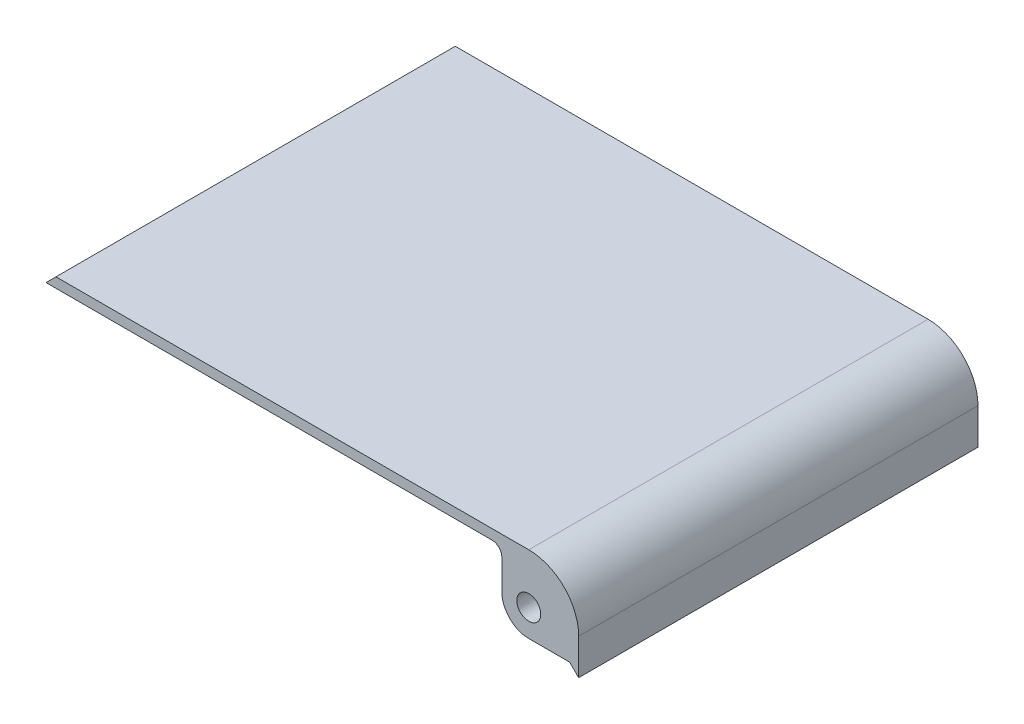
ISO-10303-21;
HEADER;
FILE_DESCRIPTION(('STEP AP214'),'2;1');
FILE_NAME('part.step','',(''),(''),'','','');
FILE_SCHEMA(('AUTOMOTIVE_DESIGN { 1 0 10303 214 1 1 1 1 }'));
ENDSEC;
DATA;
#1=APPLICATION_CONTEXT('core data for automotive mechanical design processes');
#2=APPLICATION_PROTOCOL_DEFINITION('international standard','automotive_design',2000,#1);
#3=PRODUCT_CONTEXT('',#1,'mechanical');
#4=PRODUCT('Part','Part','',(#3));
#5=PRODUCT_RELATED_PRODUCT_CATEGORY('part','',(#4));
#6=PRODUCT_DEFINITION_FORMATION('','',#4);
#7=PRODUCT_DEFINITION_CONTEXT('part definition',#1,'design');
#8=PRODUCT_DEFINITION('design','',#6,#7);
#9=PRODUCT_DEFINITION_SHAPE('','',#8);
#10=(LENGTH_UNIT() NAMED_UNIT(*) SI_UNIT(.MILLI.,.METRE.));
#11=(NAMED_UNIT(*) PLANE_ANGLE_UNIT() SI_UNIT($,.RADIAN.));
#12=(NAMED_UNIT(*) SI_UNIT($,.STERADIAN.) SOLID_ANGLE_UNIT());
#13=UNCERTAINTY_MEASURE_WITH_UNIT(LENGTH_MEASURE(1.E-05),#10,'distance_accuracy_value','');
#14=(GEOMETRIC_REPRESENTATION_CONTEXT(3) GLOBAL_UNCERTAINTY_ASSIGNED_CONTEXT((#13)) GLOBAL_UNIT_ASSIGNED_CONTEXT((#10,
#11,#12)) REPRESENTATION_CONTEXT('',''));
#15=CARTESIAN_POINT('',(0.,0.,0.));
#16=DIRECTION('',(0.,0.,1.));
#17=DIRECTION('',(1.,0.,0.));
#18=AXIS2_PLACEMENT_3D('',#15,#16,#17);
#19=CARTESIAN_POINT('',(170.,0.,80.));
#20=DIRECTION('',(-1.,0.,0.));
#21=DIRECTION('',(0.,0.,1.));
#22=AXIS2_PLACEMENT_3D('',#19,#20,#21);
#23=PLANE('',#22);
#24=DIRECTION('',(0.,-1.,0.));
#25=VECTOR('',#24,1.);
#26=CARTESIAN_POINT('',(170.,133.6,62.));
#27=LINE('',#26,#25);
#28=CARTESIAN_POINT('',(170.,140.,62.));
#29=VERTEX_POINT('',#28);
#30=CARTESIAN_POINT('',(170.,136.6,62.));
#31=VERTEX_POINT('',#30);
#32=EDGE_CURVE('E306',#29,#31,#27,.T.);
#33=ORIENTED_EDGE('',*,*,#32,.F.);
#34=DIRECTION('',(0.,0.,-1.));
#35=VECTOR('',#34,1.);
#36=CARTESIAN_POINT('',(170.,140.,0.));
#37=LINE('',#36,#35);
#38=CARTESIAN_POINT('',(170.,140.,18.));
#39=VERTEX_POINT('',#38);
#40=EDGE_CURVE('E391',#29,#39,#37,.T.);
#41=ORIENTED_EDGE('',*,*,#40,.T.);
#42=DIRECTION('',(0.,1.,0.));
#43=VECTOR('',#42,1.);
#44=CARTESIAN_POINT('',(170.,133.6,18.));
#45=LINE('',#44,#43);
#46=CARTESIAN_POINT('',(170.,136.6,18.));
#47=VERTEX_POINT('',#46);
#48=EDGE_CURVE('E284',#47,#39,#45,.T.);
#49=ORIENTED_EDGE('',*,*,#48,.F.);
#50=DIRECTION('',(0.,0.,-1.));
#51=VECTOR('',#50,1.);
#52=CARTESIAN_POINT('',(170.,136.6,80.));
#53=LINE('',#52,#51);
#54=EDGE_CURVE('E320',#31,#47,#53,.T.);
#55=ORIENTED_EDGE('',*,*,#54,.F.);
#56=EDGE_LOOP('',(#33,#41,#49,#55));
#57=FACE_BOUND('',#56,.T.);
#58=ADVANCED_FACE('F65',(#57),#23,.T.);
#59=CARTESIAN_POINT('',(162.,142.,5.));
#60=DIRECTION('',(0.,0.,-1.));
#61=DIRECTION('',(1.,0.,0.));
#62=AXIS2_PLACEMENT_3D('',#59,#60,#61);
#63=PLANE('',#62);
#64=CARTESIAN_POINT('',(162.,142.,5.));
#65=DIRECTION('',(0.,0.,1.));
#66=DIRECTION('',(1.,0.,0.));
#67=AXIS2_PLACEMENT_3D('',#64,#65,#66);
#68=CIRCLE('',#67,2.4);
#69=CARTESIAN_POINT('',(164.4,142.,5.));
#70=VERTEX_POINT('',#69);
#71=EDGE_CURVE('E325',#70,#70,#68,.T.);
#72=ORIENTED_EDGE('',*,*,#71,.F.);
#73=EDGE_LOOP('',(#72));
#74=FACE_BOUND('',#73,.T.);
#75=DIRECTION('',(0.,-1.,0.));
#76=VECTOR('',#75,1.);
#77=CARTESIAN_POINT('',(168.,133.6,5.));
#78=LINE('',#77,#76);
#79=CARTESIAN_POINT('',(168.,140.99682335333,5.));
#80=VERTEX_POINT('',#79);
#81=CARTESIAN_POINT('',(168.,136.6,5.));
#82=VERTEX_POINT('',#81);
#83=EDGE_CURVE('E272',#80,#82,#78,.T.);
#84=ORIENTED_EDGE('',*,*,#83,.F.);
#85=DIRECTION('',(-0.400237896722259,-0.916411275589374,0.));
#86=VECTOR('',#85,1.);
#87=CARTESIAN_POINT('',(167.389944606836,139.6,5.));
#88=LINE('',#87,#86);
#89=CARTESIAN_POINT('',(169.237430758545,143.830127018922,5.));
#90=VERTEX_POINT('',#89);
#91=EDGE_CURVE('E447',#80,#90,#88,.F.);
#92=ORIENTED_EDGE('',*,*,#91,.T.);
#93=CARTESIAN_POINT('',(160.,140.,5.));
#94=DIRECTION('',(0.,0.,1.));
#95=DIRECTION('',(1.,0.,0.));
#96=AXIS2_PLACEMENT_3D('',#93,#94,#95);
#97=CIRCLE('',#96,10.);
#98=CARTESIAN_POINT('',(160.,150.,5.));
#99=VERTEX_POINT('',#98);
#100=EDGE_CURVE('E338',#90,#99,#97,.T.);
#101=ORIENTED_EDGE('',*,*,#100,.T.);
#102=DIRECTION('',(-1.,0.,0.));
#103=VECTOR('',#102,1.);
#104=CARTESIAN_POINT('',(160.,150.,5.));
#105=LINE('',#104,#103);
#106=CARTESIAN_POINT('',(154.6,150.,5.));
#107=VERTEX_POINT('',#106);
#108=EDGE_CURVE('E336',#99,#107,#105,.T.);
#109=ORIENTED_EDGE('',*,*,#108,.T.);
#110=CARTESIAN_POINT('',(154.6,148.,5.));
#111=DIRECTION('',(0.,0.,-1.));
#112=DIRECTION('',(-1.,0.,0.));
#113=AXIS2_PLACEMENT_3D('',#110,#111,#112);
#114=CIRCLE('',#113,2.);
#115=CARTESIAN_POINT('',(156.6,148.,5.));
#116=VERTEX_POINT('',#115);
#117=EDGE_CURVE('E427',#107,#116,#114,.T.);
#118=ORIENTED_EDGE('',*,*,#117,.T.);
#119=DIRECTION('',(0.,-1.,0.));
#120=VECTOR('',#119,1.);
#121=CARTESIAN_POINT('',(156.6,142.,5.));
#122=LINE('',#121,#120);
#123=CARTESIAN_POINT('',(156.6,142.,5.));
#124=VERTEX_POINT('',#123);
#125=EDGE_CURVE('E334',#116,#124,#122,.T.);
#126=ORIENTED_EDGE('',*,*,#125,.T.);
#127=CARTESIAN_POINT('',(162.,142.,5.));
#128=DIRECTION('',(0.,0.,1.));
#129=DIRECTION('',(1.,0.,0.));
#130=AXIS2_PLACEMENT_3D('',#127,#128,#129);
#131=CIRCLE('',#130,5.39999999999999);
#132=CARTESIAN_POINT('',(162.,136.6,5.));
#133=VERTEX_POINT('',#132);
#134=EDGE_CURVE('E331',#124,#133,#131,.T.);
#135=ORIENTED_EDGE('',*,*,#134,.T.);
#136=DIRECTION('',(1.,0.,0.));
#137=VECTOR('',#136,1.);
#138=CARTESIAN_POINT('',(162.,136.6,5.));
#139=LINE('',#138,#137);
#140=EDGE_CURVE('E341',#133,#82,#139,.T.);
#141=ORIENTED_EDGE('',*,*,#140,.T.);
#142=EDGE_LOOP('',(#84,#92,#101,#109,#118,#126,#135,#141));
#143=FACE_BOUND('',#142,.T.);
#144=ADVANCED_FACE('F500',(#74,#143),#63,.F.);
#145=CARTESIAN_POINT('',(162.,142.,75.));
#146=DIRECTION('',(0.,0.,1.));
#147=DIRECTION('',(1.,0.,0.));
#148=AXIS2_PLACEMENT_3D('',#145,#146,#147);
#149=PLANE('',#148);
#150=CARTESIAN_POINT('',(162.,142.,75.));
#151=DIRECTION('',(0.,0.,1.));
#152=DIRECTION('',(1.,0.,0.));
#153=AXIS2_PLACEMENT_3D('',#150,#151,#152);
#154=CIRCLE('',#153,2.4);
#155=CARTESIAN_POINT('',(164.4,142.,75.));
#156=VERTEX_POINT('',#155);
#157=EDGE_CURVE('E355',#156,#156,#154,.T.);
#158=ORIENTED_EDGE('',*,*,#157,.T.);
#159=EDGE_LOOP('',(#158));
#160=FACE_BOUND('',#159,.T.);
#161=DIRECTION('',(0.400237896722256,0.916411275589375,0.));
#162=VECTOR('',#161,1.);
#163=CARTESIAN_POINT('',(167.389944606836,139.6,75.));
#164=LINE('',#163,#162);
#165=CARTESIAN_POINT('',(169.237430758545,143.830127018922,75.));
#166=VERTEX_POINT('',#165);
#167=CARTESIAN_POINT('',(168.,140.99682335333,75.));
#168=VERTEX_POINT('',#167);
#169=EDGE_CURVE('E444',#166,#168,#164,.F.);
#170=ORIENTED_EDGE('',*,*,#169,.T.);
#171=DIRECTION('',(0.,-1.,0.));
#172=VECTOR('',#171,1.);
#173=CARTESIAN_POINT('',(168.,142.,75.));
#174=LINE('',#173,#172);
#175=CARTESIAN_POINT('',(168.,136.6,75.));
#176=VERTEX_POINT('',#175);
#177=EDGE_CURVE('E429',#168,#176,#174,.T.);
#178=ORIENTED_EDGE('',*,*,#177,.T.);
#179=DIRECTION('',(1.,0.,0.));
#180=VECTOR('',#179,1.);
#181=CARTESIAN_POINT('',(162.,136.6,75.));
#182=LINE('',#181,#180);
#183=CARTESIAN_POINT('',(162.,136.6,75.));
#184=VERTEX_POINT('',#183);
#185=EDGE_CURVE('E366',#184,#176,#182,.T.);
#186=ORIENTED_EDGE('',*,*,#185,.F.);
#187=CARTESIAN_POINT('',(162.,142.,75.));
#188=DIRECTION('',(0.,0.,1.));
#189=DIRECTION('',(1.,0.,0.));
#190=AXIS2_PLACEMENT_3D('',#187,#188,#189);
#191=CIRCLE('',#190,5.39999999999999);
#192=CARTESIAN_POINT('',(156.6,142.,75.));
#193=VERTEX_POINT('',#192);
#194=EDGE_CURVE('E361',#193,#184,#191,.T.);
#195=ORIENTED_EDGE('',*,*,#194,.F.);
#196=DIRECTION('',(0.,-1.,0.));
#197=VECTOR('',#196,1.);
#198=CARTESIAN_POINT('',(156.6,142.,75.));
#199=LINE('',#198,#197);
#200=CARTESIAN_POINT('',(156.6,148.,75.));
#201=VERTEX_POINT('',#200);
#202=EDGE_CURVE('E373',#201,#193,#199,.T.);
#203=ORIENTED_EDGE('',*,*,#202,.F.);
#204=CARTESIAN_POINT('',(154.6,148.,75.));
#205=DIRECTION('',(0.,0.,1.));
#206=DIRECTION('',(1.,0.,0.));
#207=AXIS2_PLACEMENT_3D('',#204,#205,#206);
#208=CIRCLE('',#207,2.);
#209=CARTESIAN_POINT('',(154.6,150.,75.));
#210=VERTEX_POINT('',#209);
#211=EDGE_CURVE('E416',#201,#210,#208,.T.);
#212=ORIENTED_EDGE('',*,*,#211,.T.);
#213=DIRECTION('',(-1.,0.,0.));
#214=VECTOR('',#213,1.);
#215=CARTESIAN_POINT('',(160.,150.,75.));
#216=LINE('',#215,#214);
#217=CARTESIAN_POINT('',(160.,150.,75.));
#218=VERTEX_POINT('',#217);
#219=EDGE_CURVE('E371',#218,#210,#216,.T.);
#220=ORIENTED_EDGE('',*,*,#219,.F.);
#221=CARTESIAN_POINT('',(160.,140.,75.));
#222=DIRECTION('',(0.,0.,1.));
#223=DIRECTION('',(1.,0.,0.));
#224=AXIS2_PLACEMENT_3D('',#221,#222,#223);
#225=CIRCLE('',#224,10.);
#226=EDGE_CURVE('E369',#166,#218,#225,.T.);
#227=ORIENTED_EDGE('',*,*,#226,.F.);
#228=EDGE_LOOP('',(#170,#178,#186,#195,#203,#212,#220,#227));
#229=FACE_BOUND('',#228,.T.);
#230=ADVANCED_FACE('F511',(#160,#229),#149,.F.);
#231=CARTESIAN_POINT('',(170.,150.,80.));
#232=DIRECTION('',(0.,-1.,0.));
#233=DIRECTION('',(1.,0.,0.));
#234=AXIS2_PLACEMENT_3D('',#231,#232,#233);
#235=PLANE('',#234);
#236=DIRECTION('',(0.,0.,-1.));
#237=VECTOR('',#236,1.);
#238=CARTESIAN_POINT('',(65.2822509939086,150.,80.));
#239=LINE('',#238,#237);
#240=CARTESIAN_POINT('',(65.2822509939086,150.,80.));
#241=VERTEX_POINT('',#240);
#242=CARTESIAN_POINT('',(65.2822509939086,150.,0.));
#243=VERTEX_POINT('',#242);
#244=EDGE_CURVE('E318',#241,#243,#239,.T.);
#245=ORIENTED_EDGE('',*,*,#244,.T.);
#246=DIRECTION('',(-1.,0.,0.));
#247=VECTOR('',#246,1.);
#248=CARTESIAN_POINT('',(170.,150.,0.));
#249=LINE('',#248,#247);
#250=CARTESIAN_POINT('',(154.6,150.,0.));
#251=VERTEX_POINT('',#250);
#252=EDGE_CURVE('E382',#251,#243,#249,.T.);
#253=ORIENTED_EDGE('',*,*,#252,.F.);
#254=DIRECTION('',(0.,0.,-1.));
#255=VECTOR('',#254,1.);
#256=CARTESIAN_POINT('',(154.6,150.,80.));
#257=LINE('',#256,#255);
#258=EDGE_CURVE('E422',#251,#107,#257,.F.);
#259=ORIENTED_EDGE('',*,*,#258,.T.);
#260=ORIENTED_EDGE('',*,*,#108,.F.);
#261=DIRECTION('',(0.,0.,-1.));
#262=VECTOR('',#261,1.);
#263=CARTESIAN_POINT('',(160.,150.,80.));
#264=LINE('',#263,#262);
#265=EDGE_CURVE('E397',#99,#218,#264,.F.);
#266=ORIENTED_EDGE('',*,*,#265,.T.);
#267=ORIENTED_EDGE('',*,*,#219,.T.);
#268=DIRECTION('',(0.,0.,1.));
#269=VECTOR('',#268,1.);
#270=CARTESIAN_POINT('',(154.6,150.,80.));
#271=LINE('',#270,#269);
#272=CARTESIAN_POINT('',(154.6,150.,80.));
#273=VERTEX_POINT('',#272);
#274=EDGE_CURVE('E409',#210,#273,#271,.T.);
#275=ORIENTED_EDGE('',*,*,#274,.T.);
#276=DIRECTION('',(-1.,0.,0.));
#277=VECTOR('',#276,1.);
#278=CARTESIAN_POINT('',(170.,150.,80.));
#279=LINE('',#278,#277);
#280=EDGE_CURVE('E384',#273,#241,#279,.T.);
#281=ORIENTED_EDGE('',*,*,#280,.T.);
#282=EDGE_LOOP('',(#245,#253,#259,#260,#266,#267,#275,#281));
#283=FACE_BOUND('',#282,.T.);
#284=ADVANCED_FACE('F468',(#283),#235,.T.);
#285=CARTESIAN_POINT('',(160.,140.,80.));
#286=DIRECTION('',(0.,0.,1.));
#287=DIRECTION('',(1.,0.,0.));
#288=AXIS2_PLACEMENT_3D('',#285,#286,#287);
#289=CYLINDRICAL_SURFACE('',#288,10.);
#290=ORIENTED_EDGE('',*,*,#40,.F.);
#291=CARTESIAN_POINT('',(160.,140.,62.));
#292=DIRECTION('',(0.,0.,1.));
#293=DIRECTION('',(1.,0.,0.));
#294=AXIS2_PLACEMENT_3D('',#291,#292,#293);
#295=CIRCLE('',#294,10.);
#296=CARTESIAN_POINT('',(169.237430758545,143.830127018922,62.));
#297=VERTEX_POINT('',#296);
#298=EDGE_CURVE('E441',#29,#297,#295,.T.);
#299=ORIENTED_EDGE('',*,*,#298,.T.);
#300=DIRECTION('',(0.,0.,1.));
#301=VECTOR('',#300,1.);
#302=CARTESIAN_POINT('',(169.237430758545,143.830127018922,80.));
#303=LINE('',#302,#301);
#304=EDGE_CURVE('E438',#297,#166,#303,.T.);
#305=ORIENTED_EDGE('',*,*,#304,.T.);
#306=ORIENTED_EDGE('',*,*,#226,.T.);
#307=ORIENTED_EDGE('',*,*,#265,.F.);
#308=ORIENTED_EDGE('',*,*,#100,.F.);
#309=DIRECTION('',(0.,0.,1.));
#310=VECTOR('',#309,1.);
#311=CARTESIAN_POINT('',(169.237430758545,143.830127018922,80.));
#312=LINE('',#311,#310);
#313=CARTESIAN_POINT('',(169.237430758545,143.830127018922,18.));
#314=VERTEX_POINT('',#313);
#315=EDGE_CURVE('E435',#90,#314,#312,.T.);
#316=ORIENTED_EDGE('',*,*,#315,.T.);
#317=CARTESIAN_POINT('',(160.,140.,18.));
#318=DIRECTION('',(0.,0.,-1.));
#319=DIRECTION('',(-1.,0.,0.));
#320=AXIS2_PLACEMENT_3D('',#317,#318,#319);
#321=CIRCLE('',#320,10.);
#322=EDGE_CURVE('E432',#314,#39,#321,.T.);
#323=ORIENTED_EDGE('',*,*,#322,.T.);
#324=EDGE_LOOP('',(#290,#299,#305,#306,#307,#308,#316,#323));
#325=FACE_BOUND('',#324,.T.);
#326=ADVANCED_FACE('F506',(#325),#289,.F.);
#327=CARTESIAN_POINT('',(0.,0.,80.));
#328=DIRECTION('',(0.,0.,1.));
#329=DIRECTION('',(1.,0.,0.));
#330=AXIS2_PLACEMENT_3D('',#327,#328,#329);
#331=PLANE('',#330);
#332=DIRECTION('',(-1.,0.,0.));
#333=VECTOR('',#332,1.);
#334=CARTESIAN_POINT('',(170.,152.,80.));
#335=LINE('',#334,#333);
#336=CARTESIAN_POINT('',(162.,152.,80.));
#337=VERTEX_POINT('',#336);
#338=CARTESIAN_POINT('',(67.2822509939086,152.,80.));
#339=VERTEX_POINT('',#338);
#340=EDGE_CURVE('E253',#337,#339,#335,.T.);
#341=ORIENTED_EDGE('',*,*,#340,.T.);
#342=DIRECTION('',(0.707106781186548,0.707106781186548,0.));
#343=VECTOR('',#342,1.);
#344=CARTESIAN_POINT('',(-42.3588745030457,42.3588745030457,80.));
#345=LINE('',#344,#343);
#346=EDGE_CURVE('E73',#339,#241,#345,.F.);
#347=ORIENTED_EDGE('',*,*,#346,.T.);
#348=ORIENTED_EDGE('',*,*,#280,.F.);
#349=CARTESIAN_POINT('',(154.6,148.,80.));
#350=DIRECTION('',(0.,0.,1.));
#351=DIRECTION('',(1.,0.,0.));
#352=AXIS2_PLACEMENT_3D('',#349,#350,#351);
#353=CIRCLE('',#352,2.);
#354=CARTESIAN_POINT('',(156.6,148.,80.));
#355=VERTEX_POINT('',#354);
#356=EDGE_CURVE('E414',#273,#355,#353,.F.);
#357=ORIENTED_EDGE('',*,*,#356,.T.);
#358=DIRECTION('',(0.,-1.,0.));
#359=VECTOR('',#358,1.);
#360=CARTESIAN_POINT('',(156.6,142.,80.));
#361=LINE('',#360,#359);
#362=CARTESIAN_POINT('',(156.6,142.,80.));
#363=VERTEX_POINT('',#362);
#364=EDGE_CURVE('E365',#355,#363,#361,.T.);
#365=ORIENTED_EDGE('',*,*,#364,.T.);
#366=CARTESIAN_POINT('',(162.,142.,80.));
#367=DIRECTION('',(0.,0.,1.));
#368=DIRECTION('',(1.,0.,0.));
#369=AXIS2_PLACEMENT_3D('',#366,#367,#368);
#370=CIRCLE('',#369,5.39999999999999);
#371=CARTESIAN_POINT('',(162.,136.6,80.));
#372=VERTEX_POINT('',#371);
#373=EDGE_CURVE('E358',#363,#372,#370,.T.);
#374=ORIENTED_EDGE('',*,*,#373,.T.);
#375=DIRECTION('',(1.,0.,0.));
#376=VECTOR('',#375,1.);
#377=CARTESIAN_POINT('',(162.,136.6,80.));
#378=LINE('',#377,#376);
#379=CARTESIAN_POINT('',(170.2,136.6,80.));
#380=VERTEX_POINT('',#379);
#381=EDGE_CURVE('E266',#372,#380,#378,.T.);
#382=ORIENTED_EDGE('',*,*,#381,.T.);
#383=DIRECTION('',(0.707106781186542,-0.707106781186553,0.));
#384=VECTOR('',#383,1.);
#385=CARTESIAN_POINT('',(172.,134.8,80.));
#386=LINE('',#385,#384);
#387=CARTESIAN_POINT('',(172.,134.8,80.));
#388=VERTEX_POINT('',#387);
#389=EDGE_CURVE('E259',#380,#388,#386,.T.);
#390=ORIENTED_EDGE('',*,*,#389,.T.);
#391=DIRECTION('',(0.,1.,0.));
#392=VECTOR('',#391,1.);
#393=CARTESIAN_POINT('',(172.,0.,80.));
#394=LINE('',#393,#392);
#395=CARTESIAN_POINT('',(172.,142.,80.));
#396=VERTEX_POINT('',#395);
#397=EDGE_CURVE('E243',#388,#396,#394,.T.);
#398=ORIENTED_EDGE('',*,*,#397,.T.);
#399=CARTESIAN_POINT('',(162.,142.,80.));
#400=DIRECTION('',(0.,0.,1.));
#401=DIRECTION('',(1.,0.,0.));
#402=AXIS2_PLACEMENT_3D('',#399,#400,#401);
#403=CIRCLE('',#402,10.);
#404=EDGE_CURVE('E407',#396,#337,#403,.T.);
#405=ORIENTED_EDGE('',*,*,#404,.T.);
#406=EDGE_LOOP('',(#341,#347,#348,#357,#365,#374,#382,#390,#398,#405));
#407=FACE_BOUND('',#406,.T.);
#408=CARTESIAN_POINT('',(162.,142.,80.));
#409=DIRECTION('',(0.,0.,1.));
#410=DIRECTION('',(1.,0.,0.));
#411=AXIS2_PLACEMENT_3D('',#408,#409,#410);
#412=CIRCLE('',#411,2.4);
#413=CARTESIAN_POINT('',(164.4,142.,80.));
#414=VERTEX_POINT('',#413);
#415=EDGE_CURVE('E352',#414,#414,#412,.T.);
#416=ORIENTED_EDGE('',*,*,#415,.F.);
#417=EDGE_LOOP('',(#416));
#418=FACE_BOUND('',#417,.T.);
#419=ADVANCED_FACE('F263',(#407,#418),#331,.T.);
#420=CARTESIAN_POINT('',(0.,0.,0.));
#421=DIRECTION('',(0.,0.,1.));
#422=DIRECTION('',(1.,0.,0.));
#423=AXIS2_PLACEMENT_3D('',#420,#421,#422);
#424=PLANE('',#423);
#425=ORIENTED_EDGE('',*,*,#252,.T.);
#426=DIRECTION('',(-0.707106781186548,-0.707106781186548,0.));
#427=VECTOR('',#426,1.);
#428=CARTESIAN_POINT('',(67.2822509939086,152.,0.));
#429=LINE('',#428,#427);
#430=CARTESIAN_POINT('',(67.2822509939086,152.,0.));
#431=VERTEX_POINT('',#430);
#432=EDGE_CURVE('E12',#243,#431,#429,.F.);
#433=ORIENTED_EDGE('',*,*,#432,.T.);
#434=DIRECTION('',(-1.,0.,0.));
#435=VECTOR('',#434,1.);
#436=CARTESIAN_POINT('',(170.,152.,0.));
#437=LINE('',#436,#435);
#438=CARTESIAN_POINT('',(162.,152.,0.));
#439=VERTEX_POINT('',#438);
#440=EDGE_CURVE('E254',#439,#431,#437,.T.);
#441=ORIENTED_EDGE('',*,*,#440,.F.);
#442=CARTESIAN_POINT('',(162.,142.,0.));
#443=DIRECTION('',(0.,0.,1.));
#444=DIRECTION('',(1.,0.,0.));
#445=AXIS2_PLACEMENT_3D('',#442,#443,#444);
#446=CIRCLE('',#445,10.);
#447=CARTESIAN_POINT('',(172.,142.,0.));
#448=VERTEX_POINT('',#447);
#449=EDGE_CURVE('E404',#439,#448,#446,.F.);
#450=ORIENTED_EDGE('',*,*,#449,.T.);
#451=DIRECTION('',(0.,1.,0.));
#452=VECTOR('',#451,1.);
#453=CARTESIAN_POINT('',(172.,0.,0.));
#454=LINE('',#453,#452);
#455=CARTESIAN_POINT('',(172.,134.8,0.));
#456=VERTEX_POINT('',#455);
#457=EDGE_CURVE('E387',#456,#448,#454,.T.);
#458=ORIENTED_EDGE('',*,*,#457,.F.);
#459=DIRECTION('',(-0.707106781186542,0.707106781186553,0.));
#460=VECTOR('',#459,1.);
#461=CARTESIAN_POINT('',(172.,134.8,0.));
#462=LINE('',#461,#460);
#463=CARTESIAN_POINT('',(170.2,136.6,0.));
#464=VERTEX_POINT('',#463);
#465=EDGE_CURVE('E260',#456,#464,#462,.T.);
#466=ORIENTED_EDGE('',*,*,#465,.T.);
#467=DIRECTION('',(1.,0.,0.));
#468=VECTOR('',#467,1.);
#469=CARTESIAN_POINT('',(162.,136.6,0.));
#470=LINE('',#469,#468);
#471=CARTESIAN_POINT('',(162.,136.6,0.));
#472=VERTEX_POINT('',#471);
#473=EDGE_CURVE('E85',#472,#464,#470,.T.);
#474=ORIENTED_EDGE('',*,*,#473,.F.);
#475=CARTESIAN_POINT('',(162.,142.,0.));
#476=DIRECTION('',(0.,0.,1.));
#477=DIRECTION('',(1.,0.,0.));
#478=AXIS2_PLACEMENT_3D('',#475,#476,#477);
#479=CIRCLE('',#478,5.39999999999999);
#480=CARTESIAN_POINT('',(156.6,142.,0.));
#481=VERTEX_POINT('',#480);
#482=EDGE_CURVE('E328',#481,#472,#479,.T.);
#483=ORIENTED_EDGE('',*,*,#482,.F.);
#484=DIRECTION('',(0.,-1.,0.));
#485=VECTOR('',#484,1.);
#486=CARTESIAN_POINT('',(156.6,142.,0.));
#487=LINE('',#486,#485);
#488=CARTESIAN_POINT('',(156.6,148.,0.));
#489=VERTEX_POINT('',#488);
#490=EDGE_CURVE('E347',#489,#481,#487,.T.);
#491=ORIENTED_EDGE('',*,*,#490,.F.);
#492=CARTESIAN_POINT('',(154.6,148.,0.));
#493=DIRECTION('',(0.,0.,1.));
#494=DIRECTION('',(1.,0.,0.));
#495=AXIS2_PLACEMENT_3D('',#492,#493,#494);
#496=CIRCLE('',#495,2.);
#497=EDGE_CURVE('E425',#489,#251,#496,.T.);
#498=ORIENTED_EDGE('',*,*,#497,.T.);
#499=EDGE_LOOP('',(#425,#433,#441,#450,#458,#466,#474,#483,#491,#498));
#500=FACE_BOUND('',#499,.T.);
#501=CARTESIAN_POINT('',(162.,142.,0.));
#502=DIRECTION('',(0.,0.,1.));
#503=DIRECTION('',(1.,0.,0.));
#504=AXIS2_PLACEMENT_3D('',#501,#502,#503);
#505=CIRCLE('',#504,2.4);
#506=CARTESIAN_POINT('',(164.4,142.,0.));
#507=VERTEX_POINT('',#506);
#508=EDGE_CURVE('E324',#507,#507,#505,.T.);
#509=ORIENTED_EDGE('',*,*,#508,.T.);
#510=EDGE_LOOP('',(#509));
#511=FACE_BOUND('',#510,.T.);
#512=ADVANCED_FACE('F474',(#500,#511),#424,.F.);
#513=CARTESIAN_POINT('',(172.,0.,80.));
#514=DIRECTION('',(-1.,0.,0.));
#515=DIRECTION('',(0.,0.,1.));
#516=AXIS2_PLACEMENT_3D('',#513,#514,#515);
#517=PLANE('',#516);
#518=ORIENTED_EDGE('',*,*,#397,.F.);
#519=DIRECTION('',(0.,0.,1.));
#520=VECTOR('',#519,1.);
#521=CARTESIAN_POINT('',(172.,134.8,-2.5455844122716));
#522=LINE('',#521,#520);
#523=EDGE_CURVE('E246',#456,#388,#522,.T.);
#524=ORIENTED_EDGE('',*,*,#523,.F.);
#525=ORIENTED_EDGE('',*,*,#457,.T.);
#526=DIRECTION('',(0.,0.,-1.));
#527=VECTOR('',#526,1.);
#528=CARTESIAN_POINT('',(172.,142.,80.));
#529=LINE('',#528,#527);
#530=EDGE_CURVE('E249',#448,#396,#529,.F.);
#531=ORIENTED_EDGE('',*,*,#530,.T.);
#532=EDGE_LOOP('',(#518,#524,#525,#531));
#533=FACE_BOUND('',#532,.T.);
#534=ADVANCED_FACE('F245',(#533),#517,.F.);
#535=CARTESIAN_POINT('',(170.,152.,80.));
#536=DIRECTION('',(0.,-1.,0.));
#537=DIRECTION('',(1.,0.,0.));
#538=AXIS2_PLACEMENT_3D('',#535,#536,#537);
#539=PLANE('',#538);
#540=ORIENTED_EDGE('',*,*,#440,.T.);
#541=DIRECTION('',(0.,0.,1.));
#542=VECTOR('',#541,1.);
#543=CARTESIAN_POINT('',(67.2822509939086,152.,80.));
#544=LINE('',#543,#542);
#545=EDGE_CURVE('E460',#431,#339,#544,.T.);
#546=ORIENTED_EDGE('',*,*,#545,.T.);
#547=ORIENTED_EDGE('',*,*,#340,.F.);
#548=DIRECTION('',(0.,0.,-1.));
#549=VECTOR('',#548,1.);
#550=CARTESIAN_POINT('',(162.,152.,80.));
#551=LINE('',#550,#549);
#552=EDGE_CURVE('E400',#337,#439,#551,.T.);
#553=ORIENTED_EDGE('',*,*,#552,.T.);
#554=EDGE_LOOP('',(#540,#546,#547,#553));
#555=FACE_BOUND('',#554,.T.);
#556=ADVANCED_FACE('F477',(#555),#539,.F.);
#557=CARTESIAN_POINT('',(162.,142.,80.));
#558=DIRECTION('',(0.,0.,-1.));
#559=DIRECTION('',(-1.,0.,0.));
#560=AXIS2_PLACEMENT_3D('',#557,#558,#559);
#561=CYLINDRICAL_SURFACE('',#560,10.);
#562=ORIENTED_EDGE('',*,*,#404,.F.);
#563=ORIENTED_EDGE('',*,*,#530,.F.);
#564=ORIENTED_EDGE('',*,*,#449,.F.);
#565=ORIENTED_EDGE('',*,*,#552,.F.);
#566=EDGE_LOOP('',(#562,#563,#564,#565));
#567=FACE_BOUND('',#566,.T.);
#568=ADVANCED_FACE('F480',(#567),#561,.T.);
#569=CARTESIAN_POINT('',(162.,142.,75.));
#570=DIRECTION('',(0.,0.,1.));
#571=DIRECTION('',(1.,0.,0.));
#572=AXIS2_PLACEMENT_3D('',#569,#570,#571);
#573=CYLINDRICAL_SURFACE('',#572,5.39999999999999);
#574=ORIENTED_EDGE('',*,*,#373,.F.);
#575=DIRECTION('',(0.,0.,1.));
#576=VECTOR('',#575,1.);
#577=CARTESIAN_POINT('',(156.6,142.,75.));
#578=LINE('',#577,#576);
#579=EDGE_CURVE('E379',#193,#363,#578,.T.);
#580=ORIENTED_EDGE('',*,*,#579,.F.);
#581=ORIENTED_EDGE('',*,*,#194,.T.);
#582=DIRECTION('',(0.,0.,1.));
#583=VECTOR('',#582,1.);
#584=CARTESIAN_POINT('',(162.,136.6,75.));
#585=LINE('',#584,#583);
#586=EDGE_CURVE('E375',#184,#372,#585,.T.);
#587=ORIENTED_EDGE('',*,*,#586,.T.);
#588=EDGE_LOOP('',(#574,#580,#581,#587));
#589=FACE_BOUND('',#588,.T.);
#590=ADVANCED_FACE('F525',(#589),#573,.T.);
#591=CARTESIAN_POINT('',(156.6,142.,75.));
#592=DIRECTION('',(-1.,0.,0.));
#593=DIRECTION('',(0.,0.,1.));
#594=AXIS2_PLACEMENT_3D('',#591,#592,#593);
#595=PLANE('',#594);
#596=ORIENTED_EDGE('',*,*,#364,.F.);
#597=DIRECTION('',(0.,0.,1.));
#598=VECTOR('',#597,1.);
#599=CARTESIAN_POINT('',(156.6,148.,75.));
#600=LINE('',#599,#598);
#601=EDGE_CURVE('E412',#355,#201,#600,.F.);
#602=ORIENTED_EDGE('',*,*,#601,.T.);
#603=ORIENTED_EDGE('',*,*,#202,.T.);
#604=ORIENTED_EDGE('',*,*,#579,.T.);
#605=EDGE_LOOP('',(#596,#602,#603,#604));
#606=FACE_BOUND('',#605,.T.);
#607=ADVANCED_FACE('F521',(#606),#595,.T.);
#608=CARTESIAN_POINT('',(162.,136.6,75.));
#609=DIRECTION('',(0.,-1.,0.));
#610=DIRECTION('',(0.,0.,-1.));
#611=AXIS2_PLACEMENT_3D('',#608,#609,#610);
#612=PLANE('',#611);
#613=DIRECTION('',(0.,0.,1.));
#614=VECTOR('',#613,1.);
#615=CARTESIAN_POINT('',(170.2,136.6,-2.5455844122716));
#616=LINE('',#615,#614);
#617=EDGE_CURVE('E80',#464,#380,#616,.T.);
#618=ORIENTED_EDGE('',*,*,#617,.T.);
#619=ORIENTED_EDGE('',*,*,#381,.F.);
#620=ORIENTED_EDGE('',*,*,#586,.F.);
#621=ORIENTED_EDGE('',*,*,#185,.T.);
#622=CARTESIAN_POINT('',(170.,136.6,75.));
#623=VERTEX_POINT('',#622);
#624=EDGE_CURVE('E364',#176,#623,#182,.T.);
#625=ORIENTED_EDGE('',*,*,#624,.T.);
#626=EDGE_CURVE('E321',#623,#31,#53,.T.);
#627=ORIENTED_EDGE('',*,*,#626,.T.);
#628=ORIENTED_EDGE('',*,*,#54,.T.);
#629=DIRECTION('',(0.,0.,-1.));
#630=VECTOR('',#629,1.);
#631=CARTESIAN_POINT('',(170.,136.6,75.));
#632=LINE('',#631,#630);
#633=CARTESIAN_POINT('',(170.,136.6,5.));
#634=VERTEX_POINT('',#633);
#635=EDGE_CURVE('E293',#47,#634,#632,.T.);
#636=ORIENTED_EDGE('',*,*,#635,.T.);
#637=EDGE_CURVE('E340',#82,#634,#139,.T.);
#638=ORIENTED_EDGE('',*,*,#637,.F.);
#639=ORIENTED_EDGE('',*,*,#140,.F.);
#640=DIRECTION('',(0.,0.,-1.));
#641=VECTOR('',#640,1.);
#642=CARTESIAN_POINT('',(162.,136.6,5.));
#643=LINE('',#642,#641);
#644=EDGE_CURVE('E350',#133,#472,#643,.T.);
#645=ORIENTED_EDGE('',*,*,#644,.T.);
#646=ORIENTED_EDGE('',*,*,#473,.T.);
#647=EDGE_LOOP('',(#618,#619,#620,#621,#625,#627,#628,#636,#638,#639,#645,#646));
#648=FACE_BOUND('',#647,.T.);
#649=ADVANCED_FACE('F484',(#648),#612,.T.);
#650=CARTESIAN_POINT('',(162.,142.,75.));
#651=DIRECTION('',(0.,0.,1.));
#652=DIRECTION('',(1.,0.,0.));
#653=AXIS2_PLACEMENT_3D('',#650,#651,#652);
#654=CYLINDRICAL_SURFACE('',#653,2.4);
#655=ORIENTED_EDGE('',*,*,#157,.F.);
#656=EDGE_LOOP('',(#655));
#657=FACE_BOUND('',#656,.T.);
#658=ORIENTED_EDGE('',*,*,#415,.T.);
#659=EDGE_LOOP('',(#658));
#660=FACE_BOUND('',#659,.T.);
#661=ADVANCED_FACE('F604',(#657,#660),#654,.F.);
#662=CARTESIAN_POINT('',(154.6,148.,80.));
#663=DIRECTION('',(0.,0.,-1.));
#664=DIRECTION('',(-1.,0.,0.));
#665=AXIS2_PLACEMENT_3D('',#662,#663,#664);
#666=CYLINDRICAL_SURFACE('',#665,2.);
#667=ORIENTED_EDGE('',*,*,#211,.F.);
#668=ORIENTED_EDGE('',*,*,#601,.F.);
#669=ORIENTED_EDGE('',*,*,#356,.F.);
#670=ORIENTED_EDGE('',*,*,#274,.F.);
#671=EDGE_LOOP('',(#667,#668,#669,#670));
#672=FACE_BOUND('',#671,.T.);
#673=ADVANCED_FACE('F518',(#672),#666,.F.);
#674=CARTESIAN_POINT('',(162.,142.,5.));
#675=DIRECTION('',(0.,0.,-1.));
#676=DIRECTION('',(-1.,0.,0.));
#677=AXIS2_PLACEMENT_3D('',#674,#675,#676);
#678=CYLINDRICAL_SURFACE('',#677,5.39999999999999);
#679=ORIENTED_EDGE('',*,*,#482,.T.);
#680=ORIENTED_EDGE('',*,*,#644,.F.);
#681=ORIENTED_EDGE('',*,*,#134,.F.);
#682=DIRECTION('',(0.,0.,-1.));
#683=VECTOR('',#682,1.);
#684=CARTESIAN_POINT('',(156.6,142.,5.));
#685=LINE('',#684,#683);
#686=EDGE_CURVE('E344',#124,#481,#685,.T.);
#687=ORIENTED_EDGE('',*,*,#686,.T.);
#688=EDGE_LOOP('',(#679,#680,#681,#687));
#689=FACE_BOUND('',#688,.T.);
#690=ADVANCED_FACE('F488',(#689),#678,.T.);
#691=CARTESIAN_POINT('',(156.6,142.,5.));
#692=DIRECTION('',(1.,0.,0.));
#693=DIRECTION('',(0.,0.,-1.));
#694=AXIS2_PLACEMENT_3D('',#691,#692,#693);
#695=PLANE('',#694);
#696=ORIENTED_EDGE('',*,*,#125,.F.);
#697=DIRECTION('',(0.,0.,-1.));
#698=VECTOR('',#697,1.);
#699=CARTESIAN_POINT('',(156.6,148.,5.));
#700=LINE('',#699,#698);
#701=EDGE_CURVE('E419',#116,#489,#700,.T.);
#702=ORIENTED_EDGE('',*,*,#701,.T.);
#703=ORIENTED_EDGE('',*,*,#490,.T.);
#704=ORIENTED_EDGE('',*,*,#686,.F.);
#705=EDGE_LOOP('',(#696,#702,#703,#704));
#706=FACE_BOUND('',#705,.T.);
#707=ADVANCED_FACE('F492',(#706),#695,.F.);
#708=CARTESIAN_POINT('',(162.,142.,5.));
#709=DIRECTION('',(0.,0.,-1.));
#710=DIRECTION('',(-1.,0.,0.));
#711=AXIS2_PLACEMENT_3D('',#708,#709,#710);
#712=CYLINDRICAL_SURFACE('',#711,2.4);
#713=ORIENTED_EDGE('',*,*,#71,.T.);
#714=EDGE_LOOP('',(#713));
#715=FACE_BOUND('',#714,.T.);
#716=ORIENTED_EDGE('',*,*,#508,.F.);
#717=EDGE_LOOP('',(#716));
#718=FACE_BOUND('',#717,.T.);
#719=ADVANCED_FACE('F607',(#715,#718),#712,.F.);
#720=CARTESIAN_POINT('',(154.6,148.,5.));
#721=DIRECTION('',(0.,0.,-1.));
#722=DIRECTION('',(-1.,0.,0.));
#723=AXIS2_PLACEMENT_3D('',#720,#721,#722);
#724=CYLINDRICAL_SURFACE('',#723,2.);
#725=ORIENTED_EDGE('',*,*,#117,.F.);
#726=ORIENTED_EDGE('',*,*,#258,.F.);
#727=ORIENTED_EDGE('',*,*,#497,.F.);
#728=ORIENTED_EDGE('',*,*,#701,.F.);
#729=EDGE_LOOP('',(#725,#726,#727,#728));
#730=FACE_BOUND('',#729,.T.);
#731=ADVANCED_FACE('F498',(#730),#724,.F.);
#732=CARTESIAN_POINT('',(168.,133.6,62.));
#733=DIRECTION('',(0.,0.,1.));
#734=DIRECTION('',(1.,0.,0.));
#735=AXIS2_PLACEMENT_3D('',#732,#733,#734);
#736=PLANE('',#735);
#737=ORIENTED_EDGE('',*,*,#32,.T.);
#738=CARTESIAN_POINT('',(170.,133.6,62.));
#739=VERTEX_POINT('',#738);
#740=EDGE_CURVE('E296',#31,#739,#27,.T.);
#741=ORIENTED_EDGE('',*,*,#740,.T.);
#742=DIRECTION('',(1.,0.,0.));
#743=VECTOR('',#742,1.);
#744=CARTESIAN_POINT('',(168.,133.6,62.));
#745=LINE('',#744,#743);
#746=CARTESIAN_POINT('',(168.,133.6,62.));
#747=VERTEX_POINT('',#746);
#748=EDGE_CURVE('E315',#747,#739,#745,.T.);
#749=ORIENTED_EDGE('',*,*,#748,.F.);
#750=DIRECTION('',(0.,-1.,0.));
#751=VECTOR('',#750,1.);
#752=CARTESIAN_POINT('',(168.,133.6,62.));
#753=LINE('',#752,#751);
#754=CARTESIAN_POINT('',(168.,140.99682335333,62.));
#755=VERTEX_POINT('',#754);
#756=EDGE_CURVE('E297',#755,#747,#753,.T.);
#757=ORIENTED_EDGE('',*,*,#756,.F.);
#758=DIRECTION('',(-0.400237896722256,-0.916411275589375,0.));
#759=VECTOR('',#758,1.);
#760=CARTESIAN_POINT('',(165.286974479565,134.78489989918,62.));
#761=LINE('',#760,#759);
#762=EDGE_CURVE('E452',#755,#297,#761,.F.);
#763=ORIENTED_EDGE('',*,*,#762,.T.);
#764=ORIENTED_EDGE('',*,*,#298,.F.);
#765=EDGE_LOOP('',(#737,#741,#749,#757,#763,#764));
#766=FACE_BOUND('',#765,.T.);
#767=ADVANCED_FACE('F545',(#766),#736,.F.);
#768=CARTESIAN_POINT('',(168.,133.6,75.));
#769=DIRECTION('',(0.,1.,0.));
#770=DIRECTION('',(0.,0.,1.));
#771=AXIS2_PLACEMENT_3D('',#768,#769,#770);
#772=PLANE('',#771);
#773=DIRECTION('',(0.,0.,1.));
#774=VECTOR('',#773,1.);
#775=CARTESIAN_POINT('',(170.,133.6,75.));
#776=LINE('',#775,#774);
#777=CARTESIAN_POINT('',(170.,133.6,75.));
#778=VERTEX_POINT('',#777);
#779=EDGE_CURVE('E309',#739,#778,#776,.T.);
#780=ORIENTED_EDGE('',*,*,#779,.T.);
#781=DIRECTION('',(1.,0.,0.));
#782=VECTOR('',#781,1.);
#783=CARTESIAN_POINT('',(168.,133.6,75.));
#784=LINE('',#783,#782);
#785=CARTESIAN_POINT('',(168.,133.6,75.));
#786=VERTEX_POINT('',#785);
#787=EDGE_CURVE('E305',#786,#778,#784,.T.);
#788=ORIENTED_EDGE('',*,*,#787,.F.);
#789=DIRECTION('',(0.,0.,1.));
#790=VECTOR('',#789,1.);
#791=CARTESIAN_POINT('',(168.,133.6,75.));
#792=LINE('',#791,#790);
#793=EDGE_CURVE('E300',#747,#786,#792,.T.);
#794=ORIENTED_EDGE('',*,*,#793,.F.);
#795=ORIENTED_EDGE('',*,*,#748,.T.);
#796=EDGE_LOOP('',(#780,#788,#794,#795));
#797=FACE_BOUND('',#796,.T.);
#798=ADVANCED_FACE('F761',(#797),#772,.F.);
#799=CARTESIAN_POINT('',(168.,133.6,75.));
#800=DIRECTION('',(0.,0.,-1.));
#801=DIRECTION('',(-1.,0.,0.));
#802=AXIS2_PLACEMENT_3D('',#799,#800,#801);
#803=PLANE('',#802);
#804=ORIENTED_EDGE('',*,*,#624,.F.);
#805=DIRECTION('',(0.,1.,0.));
#806=VECTOR('',#805,1.);
#807=CARTESIAN_POINT('',(168.,133.6,75.));
#808=LINE('',#807,#806);
#809=EDGE_CURVE('E303',#786,#176,#808,.T.);
#810=ORIENTED_EDGE('',*,*,#809,.F.);
#811=ORIENTED_EDGE('',*,*,#787,.T.);
#812=DIRECTION('',(0.,1.,0.));
#813=VECTOR('',#812,1.);
#814=CARTESIAN_POINT('',(170.,133.6,75.));
#815=LINE('',#814,#813);
#816=EDGE_CURVE('E301',#778,#623,#815,.T.);
#817=ORIENTED_EDGE('',*,*,#816,.T.);
#818=EDGE_LOOP('',(#804,#810,#811,#817));
#819=FACE_BOUND('',#818,.T.);
#820=ADVANCED_FACE('F535',(#819),#803,.F.);
#821=CARTESIAN_POINT('',(168.,0.,0.));
#822=DIRECTION('',(-1.,0.,0.));
#823=DIRECTION('',(0.,0.,1.));
#824=AXIS2_PLACEMENT_3D('',#821,#822,#823);
#825=PLANE('',#824);
#826=ORIENTED_EDGE('',*,*,#756,.T.);
#827=ORIENTED_EDGE('',*,*,#793,.T.);
#828=ORIENTED_EDGE('',*,*,#809,.T.);
#829=ORIENTED_EDGE('',*,*,#177,.F.);
#830=DIRECTION('',(0.,0.,1.));
#831=VECTOR('',#830,1.);
#832=CARTESIAN_POINT('',(168.,140.99682335333,80.));
#833=LINE('',#832,#831);
#834=EDGE_CURVE('E449',#168,#755,#833,.F.);
#835=ORIENTED_EDGE('',*,*,#834,.T.);
#836=EDGE_LOOP('',(#826,#827,#828,#829,#835));
#837=FACE_BOUND('',#836,.T.);
#838=ADVANCED_FACE('F529',(#837),#825,.T.);
#839=CARTESIAN_POINT('',(170.,0.,0.));
#840=DIRECTION('',(-1.,0.,0.));
#841=DIRECTION('',(0.,0.,1.));
#842=AXIS2_PLACEMENT_3D('',#839,#840,#841);
#843=PLANE('',#842);
#844=ORIENTED_EDGE('',*,*,#626,.F.);
#845=ORIENTED_EDGE('',*,*,#816,.F.);
#846=ORIENTED_EDGE('',*,*,#779,.F.);
#847=ORIENTED_EDGE('',*,*,#740,.F.);
#848=EDGE_LOOP('',(#844,#845,#846,#847));
#849=FACE_BOUND('',#848,.T.);
#850=ADVANCED_FACE('F540',(#849),#843,.F.);
#851=CARTESIAN_POINT('',(168.,133.6,5.));
#852=DIRECTION('',(0.,0.,1.));
#853=DIRECTION('',(1.,0.,0.));
#854=AXIS2_PLACEMENT_3D('',#851,#852,#853);
#855=PLANE('',#854);
#856=ORIENTED_EDGE('',*,*,#637,.T.);
#857=DIRECTION('',(0.,-1.,0.));
#858=VECTOR('',#857,1.);
#859=CARTESIAN_POINT('',(170.,133.6,5.));
#860=LINE('',#859,#858);
#861=CARTESIAN_POINT('',(170.,133.6,5.));
#862=VERTEX_POINT('',#861);
#863=EDGE_CURVE('E271',#634,#862,#860,.T.);
#864=ORIENTED_EDGE('',*,*,#863,.T.);
#865=DIRECTION('',(1.,0.,0.));
#866=VECTOR('',#865,1.);
#867=CARTESIAN_POINT('',(168.,133.6,5.));
#868=LINE('',#867,#866);
#869=CARTESIAN_POINT('',(168.,133.6,5.));
#870=VERTEX_POINT('',#869);
#871=EDGE_CURVE('E290',#870,#862,#868,.T.);
#872=ORIENTED_EDGE('',*,*,#871,.F.);
#873=EDGE_CURVE('E276',#82,#870,#78,.T.);
#874=ORIENTED_EDGE('',*,*,#873,.F.);
#875=EDGE_LOOP('',(#856,#864,#872,#874));
#876=FACE_BOUND('',#875,.T.);
#877=ADVANCED_FACE('F569',(#876),#855,.F.);
#878=CARTESIAN_POINT('',(168.,133.6,18.));
#879=DIRECTION('',(0.,1.,0.));
#880=DIRECTION('',(0.,0.,1.));
#881=AXIS2_PLACEMENT_3D('',#878,#879,#880);
#882=PLANE('',#881);
#883=DIRECTION('',(0.,0.,1.));
#884=VECTOR('',#883,1.);
#885=CARTESIAN_POINT('',(170.,133.6,18.));
#886=LINE('',#885,#884);
#887=CARTESIAN_POINT('',(170.,133.6,18.));
#888=VERTEX_POINT('',#887);
#889=EDGE_CURVE('E282',#862,#888,#886,.T.);
#890=ORIENTED_EDGE('',*,*,#889,.T.);
#891=DIRECTION('',(1.,0.,0.));
#892=VECTOR('',#891,1.);
#893=CARTESIAN_POINT('',(168.,133.6,18.));
#894=LINE('',#893,#892);
#895=CARTESIAN_POINT('',(168.,133.6,18.));
#896=VERTEX_POINT('',#895);
#897=EDGE_CURVE('E280',#896,#888,#894,.T.);
#898=ORIENTED_EDGE('',*,*,#897,.F.);
#899=DIRECTION('',(0.,0.,1.));
#900=VECTOR('',#899,1.);
#901=CARTESIAN_POINT('',(168.,133.6,18.));
#902=LINE('',#901,#900);
#903=EDGE_CURVE('E275',#870,#896,#902,.T.);
#904=ORIENTED_EDGE('',*,*,#903,.F.);
#905=ORIENTED_EDGE('',*,*,#871,.T.);
#906=EDGE_LOOP('',(#890,#898,#904,#905));
#907=FACE_BOUND('',#906,.T.);
#908=ADVANCED_FACE('F563',(#907),#882,.F.);
#909=CARTESIAN_POINT('',(168.,133.6,18.));
#910=DIRECTION('',(0.,0.,-1.));
#911=DIRECTION('',(-1.,0.,0.));
#912=AXIS2_PLACEMENT_3D('',#909,#910,#911);
#913=PLANE('',#912);
#914=EDGE_CURVE('E285',#888,#47,#45,.T.);
#915=ORIENTED_EDGE('',*,*,#914,.T.);
#916=ORIENTED_EDGE('',*,*,#48,.T.);
#917=ORIENTED_EDGE('',*,*,#322,.F.);
#918=DIRECTION('',(0.400237896722259,0.916411275589374,0.));
#919=VECTOR('',#918,1.);
#920=CARTESIAN_POINT('',(165.286974479565,134.78489989918,18.));
#921=LINE('',#920,#919);
#922=CARTESIAN_POINT('',(168.,140.99682335333,18.));
#923=VERTEX_POINT('',#922);
#924=EDGE_CURVE('E457',#314,#923,#921,.F.);
#925=ORIENTED_EDGE('',*,*,#924,.T.);
#926=DIRECTION('',(0.,1.,0.));
#927=VECTOR('',#926,1.);
#928=CARTESIAN_POINT('',(168.,133.6,18.));
#929=LINE('',#928,#927);
#930=EDGE_CURVE('E278',#896,#923,#929,.T.);
#931=ORIENTED_EDGE('',*,*,#930,.F.);
#932=ORIENTED_EDGE('',*,*,#897,.T.);
#933=EDGE_LOOP('',(#915,#916,#917,#925,#931,#932));
#934=FACE_BOUND('',#933,.T.);
#935=ADVANCED_FACE('F550',(#934),#913,.F.);
#936=CARTESIAN_POINT('',(168.,0.,0.));
#937=DIRECTION('',(-1.,0.,0.));
#938=DIRECTION('',(0.,0.,1.));
#939=AXIS2_PLACEMENT_3D('',#936,#937,#938);
#940=PLANE('',#939);
#941=ORIENTED_EDGE('',*,*,#83,.T.);
#942=ORIENTED_EDGE('',*,*,#873,.T.);
#943=ORIENTED_EDGE('',*,*,#903,.T.);
#944=ORIENTED_EDGE('',*,*,#930,.T.);
#945=DIRECTION('',(0.,0.,1.));
#946=VECTOR('',#945,1.);
#947=CARTESIAN_POINT('',(168.,140.99682335333,80.));
#948=LINE('',#947,#946);
#949=EDGE_CURVE('E454',#923,#80,#948,.F.);
#950=ORIENTED_EDGE('',*,*,#949,.T.);
#951=EDGE_LOOP('',(#941,#942,#943,#944,#950));
#952=FACE_BOUND('',#951,.T.);
#953=ADVANCED_FACE('F559',(#952),#940,.T.);
#954=CARTESIAN_POINT('',(170.,0.,0.));
#955=DIRECTION('',(-1.,0.,0.));
#956=DIRECTION('',(0.,0.,1.));
#957=AXIS2_PLACEMENT_3D('',#954,#955,#956);
#958=PLANE('',#957);
#959=ORIENTED_EDGE('',*,*,#635,.F.);
#960=ORIENTED_EDGE('',*,*,#914,.F.);
#961=ORIENTED_EDGE('',*,*,#889,.F.);
#962=ORIENTED_EDGE('',*,*,#863,.F.);
#963=EDGE_LOOP('',(#959,#960,#961,#962));
#964=FACE_BOUND('',#963,.T.);
#965=ADVANCED_FACE('F567',(#964),#958,.F.);
#966=CARTESIAN_POINT('',(167.389944606836,139.6,80.));
#967=DIRECTION('',(-0.916411275589375,0.400237896722256,0.));
#968=DIRECTION('',(0.,0.,1.));
#969=AXIS2_PLACEMENT_3D('',#966,#967,#968);
#970=PLANE('',#969);
#971=ORIENTED_EDGE('',*,*,#169,.F.);
#972=ORIENTED_EDGE('',*,*,#304,.F.);
#973=ORIENTED_EDGE('',*,*,#762,.F.);
#974=ORIENTED_EDGE('',*,*,#834,.F.);
#975=EDGE_LOOP('',(#971,#972,#973,#974));
#976=FACE_BOUND('',#975,.T.);
#977=ADVANCED_FACE('F608',(#976),#970,.T.);
#978=CARTESIAN_POINT('',(167.389944606836,139.6,80.));
#979=DIRECTION('',(-0.916411275589373,0.400237896722259,0.));
#980=DIRECTION('',(0.,0.,1.));
#981=AXIS2_PLACEMENT_3D('',#978,#979,#980);
#982=PLANE('',#981);
#983=ORIENTED_EDGE('',*,*,#924,.F.);
#984=ORIENTED_EDGE('',*,*,#315,.F.);
#985=ORIENTED_EDGE('',*,*,#91,.F.);
#986=ORIENTED_EDGE('',*,*,#949,.F.);
#987=EDGE_LOOP('',(#983,#984,#985,#986));
#988=FACE_BOUND('',#987,.T.);
#989=ADVANCED_FACE('F554',(#988),#982,.T.);
#990=CARTESIAN_POINT('',(67.2822509939086,152.,80.));
#991=DIRECTION('',(0.707106781186547,-0.707106781186547,0.));
#992=DIRECTION('',(0.,0.,1.));
#993=AXIS2_PLACEMENT_3D('',#990,#991,#992);
#994=PLANE('',#993);
#995=ORIENTED_EDGE('',*,*,#432,.F.);
#996=ORIENTED_EDGE('',*,*,#244,.F.);
#997=ORIENTED_EDGE('',*,*,#346,.F.);
#998=ORIENTED_EDGE('',*,*,#545,.F.);
#999=EDGE_LOOP('',(#995,#996,#997,#998));
#1000=FACE_BOUND('',#999,.T.);
#1001=ADVANCED_FACE('F67',(#1000),#994,.F.);
#1002=CARTESIAN_POINT('',(172.,134.8,-2.5455844122716));
#1003=DIRECTION('',(-0.707106781186553,-0.707106781186542,0.));
#1004=DIRECTION('',(0.707106781186542,-0.707106781186553,0.));
#1005=AXIS2_PLACEMENT_3D('',#1002,#1003,#1004);
#1006=PLANE('',#1005);
#1007=ORIENTED_EDGE('',*,*,#465,.F.);
#1008=ORIENTED_EDGE('',*,*,#523,.T.);
#1009=ORIENTED_EDGE('',*,*,#389,.F.);
#1010=ORIENTED_EDGE('',*,*,#617,.F.);
#1011=EDGE_LOOP('',(#1007,#1008,#1009,#1010));
#1012=FACE_BOUND('',#1011,.T.);
#1013=ADVANCED_FACE('F258',(#1012),#1006,.T.);
#1014=CLOSED_SHELL('',(#58,#144,#230,#284,#326,#419,#512,#534,#556,#568,#590,#607,#649,#661,
#673,#690,#707,#719,#731,#767,#798,#820,#838,#850,#877,#908,#935,#953,#965,#977,#989,#1001,#1013));
#1015=MANIFOLD_SOLID_BREP('B2',#1014);
#1016=ADVANCED_BREP_SHAPE_REPRESENTATION('',(#18,#1015),#14);
#1017=SHAPE_DEFINITION_REPRESENTATION(#9,#1016);
ENDSEC;
END-ISO-10303-21;
